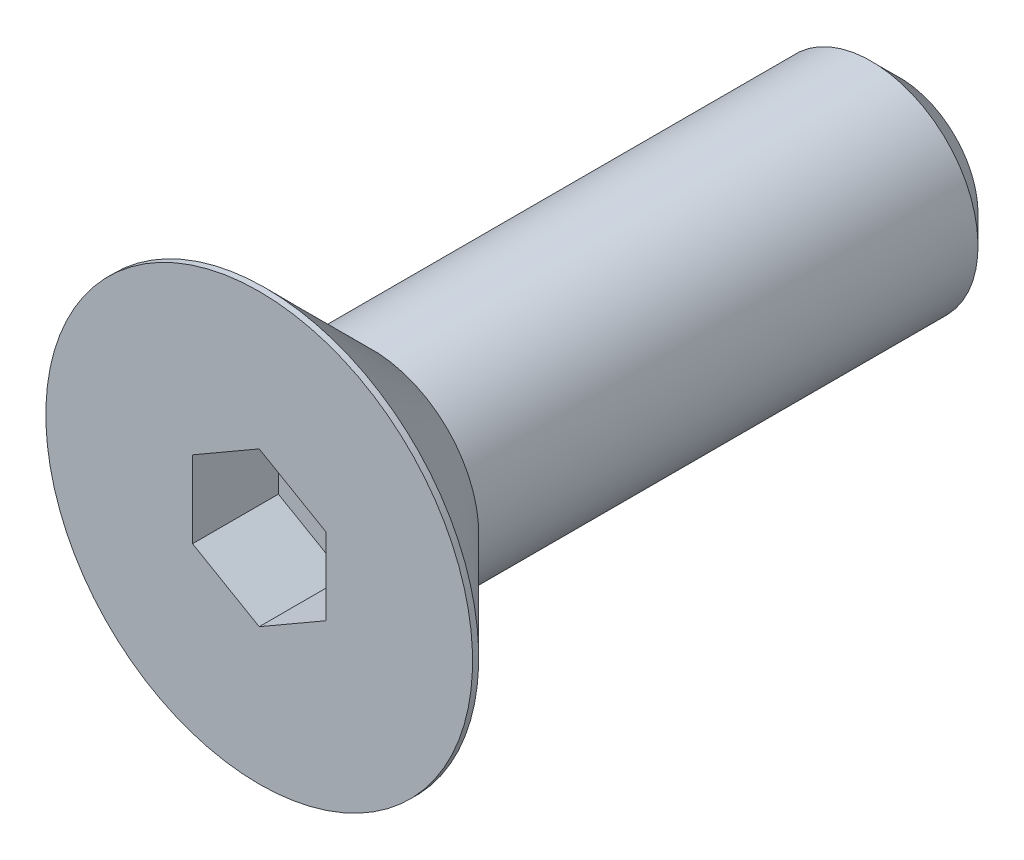
ISO-10303-21;
HEADER;
FILE_DESCRIPTION(('STEP AP214'),'2;1');
FILE_NAME('part.step','',(''),(''),'','','');
FILE_SCHEMA(('AUTOMOTIVE_DESIGN { 1 0 10303 214 1 1 1 1 }'));
ENDSEC;
DATA;
#1=APPLICATION_CONTEXT('core data for automotive mechanical design processes');
#2=APPLICATION_PROTOCOL_DEFINITION('international standard','automotive_design',2000,#1);
#3=PRODUCT_CONTEXT('',#1,'mechanical');
#4=PRODUCT('Part','Part','',(#3));
#5=PRODUCT_RELATED_PRODUCT_CATEGORY('part','',(#4));
#6=PRODUCT_DEFINITION_FORMATION('','',#4);
#7=PRODUCT_DEFINITION_CONTEXT('part definition',#1,'design');
#8=PRODUCT_DEFINITION('design','',#6,#7);
#9=PRODUCT_DEFINITION_SHAPE('','',#8);
#10=(LENGTH_UNIT() NAMED_UNIT(*) SI_UNIT(.MILLI.,.METRE.));
#11=(NAMED_UNIT(*) PLANE_ANGLE_UNIT() SI_UNIT($,.RADIAN.));
#12=(NAMED_UNIT(*) SI_UNIT($,.STERADIAN.) SOLID_ANGLE_UNIT());
#13=UNCERTAINTY_MEASURE_WITH_UNIT(LENGTH_MEASURE(1.E-05),#10,'distance_accuracy_value','');
#14=(GEOMETRIC_REPRESENTATION_CONTEXT(3) GLOBAL_UNCERTAINTY_ASSIGNED_CONTEXT((#13)) GLOBAL_UNIT_ASSIGNED_CONTEXT((#10,
#11,#12)) REPRESENTATION_CONTEXT('',''));
#15=CARTESIAN_POINT('',(0.,0.,0.));
#16=DIRECTION('',(0.,0.,1.));
#17=DIRECTION('',(1.,0.,0.));
#18=AXIS2_PLACEMENT_3D('',#15,#16,#17);
#19=CARTESIAN_POINT('',(0.,0.,5.885));
#20=DIRECTION('',(0.,0.,1.));
#21=DIRECTION('',(0.,-1.,0.));
#22=AXIS2_PLACEMENT_3D('',#19,#20,#21);
#23=CONICAL_SURFACE('',#22,4.,0.785398163397448);
#24=CARTESIAN_POINT('',(0.,0.,3.69999999999999));
#25=DIRECTION('',(0.,0.,1.));
#26=DIRECTION('',(0.,-1.,0.));
#27=AXIS2_PLACEMENT_3D('',#24,#25,#26);
#28=CIRCLE('',#27,1.815);
#29=CARTESIAN_POINT('',(0.,-1.815,3.69999999999999));
#30=VERTEX_POINT('',#29);
#31=EDGE_CURVE('E150',#30,#30,#28,.T.);
#32=ORIENTED_EDGE('',*,*,#31,.T.);
#33=EDGE_LOOP('',(#32));
#34=FACE_BOUND('',#33,.T.);
#35=CARTESIAN_POINT('',(0.,0.,5.885));
#36=DIRECTION('',(0.,0.,1.));
#37=DIRECTION('',(0.,-1.,0.));
#38=AXIS2_PLACEMENT_3D('',#35,#36,#37);
#39=CIRCLE('',#38,4.);
#40=CARTESIAN_POINT('',(0.,-4.,5.885));
#41=VERTEX_POINT('',#40);
#42=EDGE_CURVE('E12',#41,#41,#39,.T.);
#43=ORIENTED_EDGE('',*,*,#42,.F.);
#44=EDGE_LOOP('',(#43));
#45=FACE_BOUND('',#44,.T.);
#46=ADVANCED_FACE('F49',(#34,#45),#23,.T.);
#47=CARTESIAN_POINT('',(0.,0.,6.));
#48=DIRECTION('',(0.,0.,1.));
#49=DIRECTION('',(0.,-1.,0.));
#50=AXIS2_PLACEMENT_3D('',#47,#48,#49);
#51=CYLINDRICAL_SURFACE('',#50,4.);
#52=ORIENTED_EDGE('',*,*,#42,.T.);
#53=EDGE_LOOP('',(#52));
#54=FACE_BOUND('',#53,.T.);
#55=CARTESIAN_POINT('',(0.,0.,6.));
#56=DIRECTION('',(0.,0.,1.));
#57=DIRECTION('',(0.,-1.,0.));
#58=AXIS2_PLACEMENT_3D('',#55,#56,#57);
#59=CIRCLE('',#58,4.);
#60=CARTESIAN_POINT('',(0.,-4.,6.));
#61=VERTEX_POINT('',#60);
#62=EDGE_CURVE('E56',#61,#61,#59,.T.);
#63=ORIENTED_EDGE('',*,*,#62,.F.);
#64=EDGE_LOOP('',(#63));
#65=FACE_BOUND('',#64,.T.);
#66=ADVANCED_FACE('F162',(#54,#65),#51,.T.);
#67=CARTESIAN_POINT('',(0.,0.,6.));
#68=DIRECTION('',(0.,0.,-1.));
#69=DIRECTION('',(0.,1.,0.));
#70=AXIS2_PLACEMENT_3D('',#67,#68,#69);
#71=PLANE('',#70);
#72=DIRECTION('',(0.,1.,0.));
#73=VECTOR('',#72,1.);
#74=CARTESIAN_POINT('',(1.25,-0.721687836487034,6.));
#75=LINE('',#74,#73);
#76=CARTESIAN_POINT('',(1.25,-0.721687836487034,6.));
#77=VERTEX_POINT('',#76);
#78=CARTESIAN_POINT('',(1.25,0.721687836487031,6.));
#79=VERTEX_POINT('',#78);
#80=EDGE_CURVE('E137',#77,#79,#75,.T.);
#81=ORIENTED_EDGE('',*,*,#80,.F.);
#82=DIRECTION('',(0.866025403784438,0.5,0.));
#83=VECTOR('',#82,1.);
#84=CARTESIAN_POINT('',(0.,-1.44337567297407,6.));
#85=LINE('',#84,#83);
#86=CARTESIAN_POINT('',(0.,-1.44337567297407,6.));
#87=VERTEX_POINT('',#86);
#88=EDGE_CURVE('E63',#87,#77,#85,.T.);
#89=ORIENTED_EDGE('',*,*,#88,.F.);
#90=DIRECTION('',(0.866025403784439,-0.5,0.));
#91=VECTOR('',#90,1.);
#92=CARTESIAN_POINT('',(-1.25,-0.721687836487036,6.));
#93=LINE('',#92,#91);
#94=CARTESIAN_POINT('',(-1.25,-0.721687836487036,6.));
#95=VERTEX_POINT('',#94);
#96=EDGE_CURVE('E146',#95,#87,#93,.T.);
#97=ORIENTED_EDGE('',*,*,#96,.F.);
#98=DIRECTION('',(0.,-1.,0.));
#99=VECTOR('',#98,1.);
#100=CARTESIAN_POINT('',(-1.25,0.721687836487031,6.));
#101=LINE('',#100,#99);
#102=CARTESIAN_POINT('',(-1.25,0.721687836487031,6.));
#103=VERTEX_POINT('',#102);
#104=EDGE_CURVE('E144',#103,#95,#101,.T.);
#105=ORIENTED_EDGE('',*,*,#104,.F.);
#106=DIRECTION('',(-0.866025403784439,-0.5,0.));
#107=VECTOR('',#106,1.);
#108=CARTESIAN_POINT('',(0.,1.44337567297406,6.));
#109=LINE('',#108,#107);
#110=CARTESIAN_POINT('',(0.,1.44337567297406,6.));
#111=VERTEX_POINT('',#110);
#112=EDGE_CURVE('E111',#111,#103,#109,.T.);
#113=ORIENTED_EDGE('',*,*,#112,.F.);
#114=DIRECTION('',(-0.866025403784439,0.5,0.));
#115=VECTOR('',#114,1.);
#116=CARTESIAN_POINT('',(1.25,0.721687836487031,6.));
#117=LINE('',#116,#115);
#118=EDGE_CURVE('E140',#79,#111,#117,.T.);
#119=ORIENTED_EDGE('',*,*,#118,.F.);
#120=EDGE_LOOP('',(#81,#89,#97,#105,#113,#119));
#121=FACE_BOUND('',#120,.T.);
#122=ORIENTED_EDGE('',*,*,#62,.T.);
#123=EDGE_LOOP('',(#122));
#124=FACE_BOUND('',#123,.T.);
#125=ADVANCED_FACE('F160',(#121,#124),#71,.F.);
#126=CARTESIAN_POINT('',(0.,0.,3.69999999999999));
#127=DIRECTION('',(0.,0.,-1.));
#128=DIRECTION('',(0.,1.,0.));
#129=AXIS2_PLACEMENT_3D('',#126,#127,#128);
#130=PLANE('',#129);
#131=ORIENTED_EDGE('',*,*,#31,.F.);
#132=EDGE_LOOP('',(#131));
#133=FACE_BOUND('',#132,.T.);
#134=ADVANCED_FACE('F169',(#133),#130,.T.);
#135=CARTESIAN_POINT('',(0.,-1.44337567297407,4.39));
#136=DIRECTION('',(0.5,-0.866025403784438,0.));
#137=DIRECTION('',(0.866025403784438,0.5,0.));
#138=AXIS2_PLACEMENT_3D('',#135,#136,#137);
#139=PLANE('',#138);
#140=ORIENTED_EDGE('',*,*,#88,.T.);
#141=DIRECTION('',(0.,0.,1.));
#142=VECTOR('',#141,1.);
#143=CARTESIAN_POINT('',(1.25,-0.721687836487034,4.39));
#144=LINE('',#143,#142);
#145=CARTESIAN_POINT('',(1.25,-0.721687836487034,4.39));
#146=VERTEX_POINT('',#145);
#147=EDGE_CURVE('E93',#146,#77,#144,.T.);
#148=ORIENTED_EDGE('',*,*,#147,.F.);
#149=DIRECTION('',(0.866025403784438,0.5,0.));
#150=VECTOR('',#149,1.);
#151=CARTESIAN_POINT('',(0.,-1.44337567297407,4.39));
#152=LINE('',#151,#150);
#153=CARTESIAN_POINT('',(0.,-1.44337567297407,4.39));
#154=VERTEX_POINT('',#153);
#155=EDGE_CURVE('E148',#154,#146,#152,.T.);
#156=ORIENTED_EDGE('',*,*,#155,.F.);
#157=DIRECTION('',(0.,0.,1.));
#158=VECTOR('',#157,1.);
#159=CARTESIAN_POINT('',(0.,-1.44337567297407,4.39));
#160=LINE('',#159,#158);
#161=EDGE_CURVE('E71',#154,#87,#160,.T.);
#162=ORIENTED_EDGE('',*,*,#161,.T.);
#163=EDGE_LOOP('',(#140,#148,#156,#162));
#164=FACE_BOUND('',#163,.T.);
#165=ADVANCED_FACE('F176',(#164),#139,.F.);
#166=CARTESIAN_POINT('',(-1.25,-0.721687836487036,4.39));
#167=DIRECTION('',(-0.5,-0.866025403784439,0.));
#168=DIRECTION('',(0.866025403784439,-0.5,0.));
#169=AXIS2_PLACEMENT_3D('',#166,#167,#168);
#170=PLANE('',#169);
#171=ORIENTED_EDGE('',*,*,#96,.T.);
#172=ORIENTED_EDGE('',*,*,#161,.F.);
#173=DIRECTION('',(0.866025403784439,-0.5,0.));
#174=VECTOR('',#173,1.);
#175=CARTESIAN_POINT('',(-1.25,-0.721687836487036,4.39));
#176=LINE('',#175,#174);
#177=CARTESIAN_POINT('',(-1.25,-0.721687836487036,4.39));
#178=VERTEX_POINT('',#177);
#179=EDGE_CURVE('E123',#178,#154,#176,.T.);
#180=ORIENTED_EDGE('',*,*,#179,.F.);
#181=DIRECTION('',(0.,0.,1.));
#182=VECTOR('',#181,1.);
#183=CARTESIAN_POINT('',(-1.25,-0.721687836487036,4.39));
#184=LINE('',#183,#182);
#185=EDGE_CURVE('E115',#178,#95,#184,.T.);
#186=ORIENTED_EDGE('',*,*,#185,.T.);
#187=EDGE_LOOP('',(#171,#172,#180,#186));
#188=FACE_BOUND('',#187,.T.);
#189=ADVANCED_FACE('F180',(#188),#170,.F.);
#190=CARTESIAN_POINT('',(-1.25,0.721687836487031,4.39));
#191=DIRECTION('',(-1.,0.,0.));
#192=DIRECTION('',(0.,-1.,0.));
#193=AXIS2_PLACEMENT_3D('',#190,#191,#192);
#194=PLANE('',#193);
#195=ORIENTED_EDGE('',*,*,#104,.T.);
#196=ORIENTED_EDGE('',*,*,#185,.F.);
#197=DIRECTION('',(0.,-1.,0.));
#198=VECTOR('',#197,1.);
#199=CARTESIAN_POINT('',(-1.25,0.721687836487031,4.39));
#200=LINE('',#199,#198);
#201=CARTESIAN_POINT('',(-1.25,0.721687836487031,4.39));
#202=VERTEX_POINT('',#201);
#203=EDGE_CURVE('E119',#202,#178,#200,.T.);
#204=ORIENTED_EDGE('',*,*,#203,.F.);
#205=DIRECTION('',(0.,0.,1.));
#206=VECTOR('',#205,1.);
#207=CARTESIAN_POINT('',(-1.25,0.721687836487031,4.39));
#208=LINE('',#207,#206);
#209=EDGE_CURVE('E104',#202,#103,#208,.T.);
#210=ORIENTED_EDGE('',*,*,#209,.T.);
#211=EDGE_LOOP('',(#195,#196,#204,#210));
#212=FACE_BOUND('',#211,.T.);
#213=ADVANCED_FACE('F120',(#212),#194,.F.);
#214=CARTESIAN_POINT('',(0.,1.44337567297406,4.39));
#215=DIRECTION('',(-0.5,0.866025403784438,0.));
#216=DIRECTION('',(-0.866025403784439,-0.5,0.));
#217=AXIS2_PLACEMENT_3D('',#214,#215,#216);
#218=PLANE('',#217);
#219=ORIENTED_EDGE('',*,*,#112,.T.);
#220=ORIENTED_EDGE('',*,*,#209,.F.);
#221=DIRECTION('',(-0.866025403784439,-0.5,0.));
#222=VECTOR('',#221,1.);
#223=CARTESIAN_POINT('',(0.,1.44337567297406,4.39));
#224=LINE('',#223,#222);
#225=CARTESIAN_POINT('',(0.,1.44337567297406,4.39));
#226=VERTEX_POINT('',#225);
#227=EDGE_CURVE('E108',#226,#202,#224,.T.);
#228=ORIENTED_EDGE('',*,*,#227,.F.);
#229=DIRECTION('',(0.,0.,1.));
#230=VECTOR('',#229,1.);
#231=CARTESIAN_POINT('',(0.,1.44337567297406,4.39));
#232=LINE('',#231,#230);
#233=EDGE_CURVE('E116',#226,#111,#232,.T.);
#234=ORIENTED_EDGE('',*,*,#233,.T.);
#235=EDGE_LOOP('',(#219,#220,#228,#234));
#236=FACE_BOUND('',#235,.T.);
#237=ADVANCED_FACE('F106',(#236),#218,.F.);
#238=CARTESIAN_POINT('',(1.25,0.721687836487031,4.39));
#239=DIRECTION('',(0.5,0.866025403784439,0.));
#240=DIRECTION('',(-0.866025403784439,0.5,0.));
#241=AXIS2_PLACEMENT_3D('',#238,#239,#240);
#242=PLANE('',#241);
#243=ORIENTED_EDGE('',*,*,#118,.T.);
#244=ORIENTED_EDGE('',*,*,#233,.F.);
#245=DIRECTION('',(-0.866025403784439,0.5,0.));
#246=VECTOR('',#245,1.);
#247=CARTESIAN_POINT('',(1.25,0.721687836487031,4.39));
#248=LINE('',#247,#246);
#249=CARTESIAN_POINT('',(1.25,0.721687836487031,4.39));
#250=VERTEX_POINT('',#249);
#251=EDGE_CURVE('E129',#250,#226,#248,.T.);
#252=ORIENTED_EDGE('',*,*,#251,.F.);
#253=DIRECTION('',(0.,0.,1.));
#254=VECTOR('',#253,1.);
#255=CARTESIAN_POINT('',(1.25,0.721687836487031,4.39));
#256=LINE('',#255,#254);
#257=EDGE_CURVE('E153',#250,#79,#256,.T.);
#258=ORIENTED_EDGE('',*,*,#257,.T.);
#259=EDGE_LOOP('',(#243,#244,#252,#258));
#260=FACE_BOUND('',#259,.T.);
#261=ADVANCED_FACE('F184',(#260),#242,.F.);
#262=CARTESIAN_POINT('',(1.25,-0.721687836487034,4.39));
#263=DIRECTION('',(1.,0.,0.));
#264=DIRECTION('',(0.,1.,0.));
#265=AXIS2_PLACEMENT_3D('',#262,#263,#264);
#266=PLANE('',#265);
#267=ORIENTED_EDGE('',*,*,#80,.T.);
#268=ORIENTED_EDGE('',*,*,#257,.F.);
#269=DIRECTION('',(0.,1.,0.));
#270=VECTOR('',#269,1.);
#271=CARTESIAN_POINT('',(1.25,-0.721687836487034,4.39));
#272=LINE('',#271,#270);
#273=EDGE_CURVE('E131',#146,#250,#272,.T.);
#274=ORIENTED_EDGE('',*,*,#273,.F.);
#275=ORIENTED_EDGE('',*,*,#147,.T.);
#276=EDGE_LOOP('',(#267,#268,#274,#275));
#277=FACE_BOUND('',#276,.T.);
#278=ADVANCED_FACE('F181',(#277),#266,.F.);
#279=CARTESIAN_POINT('',(1.25,-0.721687836487034,4.39));
#280=DIRECTION('',(0.,0.,1.));
#281=DIRECTION('',(1.,0.,0.));
#282=AXIS2_PLACEMENT_3D('',#279,#280,#281);
#283=PLANE('',#282);
#284=ORIENTED_EDGE('',*,*,#155,.T.);
#285=ORIENTED_EDGE('',*,*,#273,.T.);
#286=ORIENTED_EDGE('',*,*,#251,.T.);
#287=ORIENTED_EDGE('',*,*,#227,.T.);
#288=ORIENTED_EDGE('',*,*,#203,.T.);
#289=ORIENTED_EDGE('',*,*,#179,.T.);
#290=EDGE_LOOP('',(#284,#285,#286,#287,#288,#289));
#291=FACE_BOUND('',#290,.T.);
#292=ADVANCED_FACE('F126',(#291),#283,.T.);
#293=CLOSED_SHELL('',(#46,#66,#125,#134,#165,#189,#213,#237,#261,#278,#292));
#294=MANIFOLD_SOLID_BREP('B2',#293);
#295=CARTESIAN_POINT('',(0.,-2.00000000000001,4.39));
#296=DIRECTION('',(0.,0.,-1.));
#297=DIRECTION('',(0.,1.,0.));
#298=AXIS2_PLACEMENT_3D('',#295,#296,#297);
#299=PLANE('',#298);
#300=CARTESIAN_POINT('',(0.,0.,4.39000000000001));
#301=DIRECTION('',(0.,0.,1.));
#302=DIRECTION('',(0.,-1.,0.));
#303=AXIS2_PLACEMENT_3D('',#300,#301,#302);
#304=CIRCLE('',#303,2.00000000000001);
#305=CARTESIAN_POINT('',(0.,-2.00000000000001,4.39000000000001));
#306=VERTEX_POINT('',#305);
#307=EDGE_CURVE('E283',#306,#306,#304,.T.);
#308=ORIENTED_EDGE('',*,*,#307,.T.);
#309=EDGE_LOOP('',(#308));
#310=FACE_BOUND('',#309,.T.);
#311=ADVANCED_FACE('F270',(#310),#299,.F.);
#312=CARTESIAN_POINT('',(0.,-2.,-6.00000000000001));
#313=DIRECTION('',(0.,0.,1.));
#314=DIRECTION('',(0.,-1.,0.));
#315=AXIS2_PLACEMENT_3D('',#312,#313,#314);
#316=PLANE('',#315);
#317=CARTESIAN_POINT('',(0.,0.,-6.00000000000001));
#318=DIRECTION('',(0.,0.,1.));
#319=DIRECTION('',(0.,-1.,0.));
#320=AXIS2_PLACEMENT_3D('',#317,#318,#319);
#321=CIRCLE('',#320,1.475);
#322=CARTESIAN_POINT('',(0.,-1.475,-6.00000000000001));
#323=VERTEX_POINT('',#322);
#324=EDGE_CURVE('E48',#323,#323,#321,.F.);
#325=ORIENTED_EDGE('',*,*,#324,.T.);
#326=EDGE_LOOP('',(#325));
#327=FACE_BOUND('',#326,.T.);
#328=ADVANCED_FACE('F294',(#327),#316,.F.);
#329=CARTESIAN_POINT('',(0.,0.,4.39));
#330=DIRECTION('',(0.,0.,1.));
#331=DIRECTION('',(0.,-1.,0.));
#332=AXIS2_PLACEMENT_3D('',#329,#330,#331);
#333=CYLINDRICAL_SURFACE('',#332,2.00000000000001);
#334=CARTESIAN_POINT('',(0.,0.,-5.475));
#335=DIRECTION('',(0.,0.,1.));
#336=DIRECTION('',(0.,-1.,0.));
#337=AXIS2_PLACEMENT_3D('',#334,#335,#336);
#338=CIRCLE('',#337,2.00000000000001);
#339=CARTESIAN_POINT('',(0.,-2.00000000000001,-5.475));
#340=VERTEX_POINT('',#339);
#341=EDGE_CURVE('E278',#340,#340,#338,.T.);
#342=ORIENTED_EDGE('',*,*,#341,.T.);
#343=EDGE_LOOP('',(#342));
#344=FACE_BOUND('',#343,.T.);
#345=ORIENTED_EDGE('',*,*,#307,.F.);
#346=EDGE_LOOP('',(#345));
#347=FACE_BOUND('',#346,.T.);
#348=ADVANCED_FACE('F292',(#344,#347),#333,.T.);
#349=CARTESIAN_POINT('',(0.,0.,-5.475));
#350=DIRECTION('',(0.,0.,1.));
#351=DIRECTION('',(0.,-1.,0.));
#352=AXIS2_PLACEMENT_3D('',#349,#350,#351);
#353=CONICAL_SURFACE('',#352,2.00000000000001,0.785398163397451);
#354=ORIENTED_EDGE('',*,*,#324,.F.);
#355=EDGE_LOOP('',(#354));
#356=FACE_BOUND('',#355,.T.);
#357=ORIENTED_EDGE('',*,*,#341,.F.);
#358=EDGE_LOOP('',(#357));
#359=FACE_BOUND('',#358,.T.);
#360=ADVANCED_FACE('F272',(#356,#359),#353,.T.);
#361=CLOSED_SHELL('',(#311,#328,#348,#360));
#362=MANIFOLD_SOLID_BREP('B6',#361);
#363=ADVANCED_BREP_SHAPE_REPRESENTATION('',(#18,#294,#362),#14);
#364=SHAPE_DEFINITION_REPRESENTATION(#9,#363);
ENDSEC;
END-ISO-10303-21;
